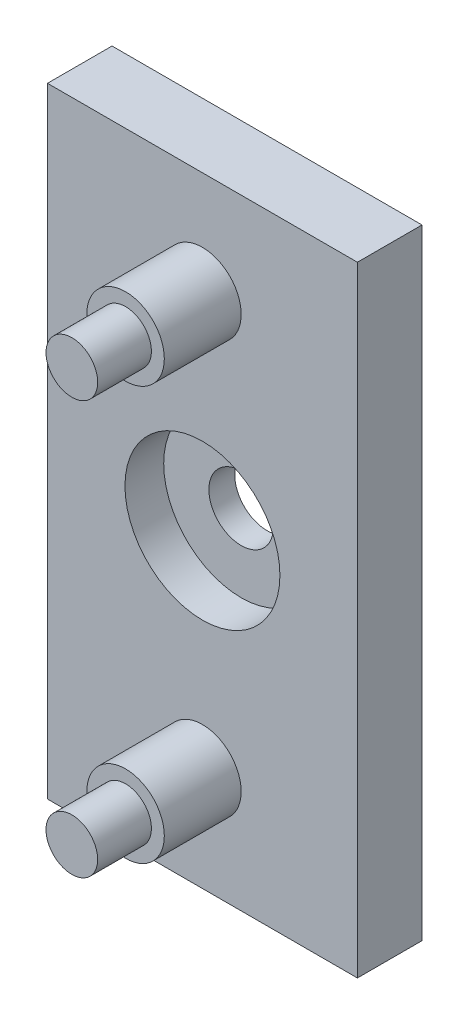
ISO-10303-21;
HEADER;
FILE_DESCRIPTION(('STEP AP214'),'2;1');
FILE_NAME('part.step','',(''),(''),'','','');
FILE_SCHEMA(('AUTOMOTIVE_DESIGN { 1 0 10303 214 1 1 1 1 }'));
ENDSEC;
DATA;
#1=APPLICATION_CONTEXT('core data for automotive mechanical design processes');
#2=APPLICATION_PROTOCOL_DEFINITION('international standard','automotive_design',2000,#1);
#3=PRODUCT_CONTEXT('',#1,'mechanical');
#4=PRODUCT('Part','Part','',(#3));
#5=PRODUCT_RELATED_PRODUCT_CATEGORY('part','',(#4));
#6=PRODUCT_DEFINITION_FORMATION('','',#4);
#7=PRODUCT_DEFINITION_CONTEXT('part definition',#1,'design');
#8=PRODUCT_DEFINITION('design','',#6,#7);
#9=PRODUCT_DEFINITION_SHAPE('','',#8);
#10=(LENGTH_UNIT() NAMED_UNIT(*) SI_UNIT(.MILLI.,.METRE.));
#11=(NAMED_UNIT(*) PLANE_ANGLE_UNIT() SI_UNIT($,.RADIAN.));
#12=(NAMED_UNIT(*) SI_UNIT($,.STERADIAN.) SOLID_ANGLE_UNIT());
#13=UNCERTAINTY_MEASURE_WITH_UNIT(LENGTH_MEASURE(1.E-05),#10,'distance_accuracy_value','');
#14=(GEOMETRIC_REPRESENTATION_CONTEXT(3) GLOBAL_UNCERTAINTY_ASSIGNED_CONTEXT((#13)) GLOBAL_UNIT_ASSIGNED_CONTEXT((#10,
#11,#12)) REPRESENTATION_CONTEXT('',''));
#15=CARTESIAN_POINT('',(0.,0.,0.));
#16=DIRECTION('',(0.,0.,1.));
#17=DIRECTION('',(1.,0.,0.));
#18=AXIS2_PLACEMENT_3D('',#15,#16,#17);
#19=CARTESIAN_POINT('',(19.05,-38.1,7.9375));
#20=DIRECTION('',(-1.,0.,0.));
#21=DIRECTION('',(0.,0.,1.));
#22=AXIS2_PLACEMENT_3D('',#19,#20,#21);
#23=PLANE('',#22);
#24=DIRECTION('',(0.,1.,0.));
#25=VECTOR('',#24,1.);
#26=CARTESIAN_POINT('',(19.05,-38.1,0.));
#27=LINE('',#26,#25);
#28=CARTESIAN_POINT('',(19.05,-38.1,0.));
#29=VERTEX_POINT('',#28);
#30=CARTESIAN_POINT('',(19.05,38.1,0.));
#31=VERTEX_POINT('',#30);
#32=EDGE_CURVE('E109',#29,#31,#27,.T.);
#33=ORIENTED_EDGE('',*,*,#32,.T.);
#34=DIRECTION('',(0.,0.,-1.));
#35=VECTOR('',#34,1.);
#36=CARTESIAN_POINT('',(19.05,38.1,7.9375));
#37=LINE('',#36,#35);
#38=CARTESIAN_POINT('',(19.05,38.1,7.9375));
#39=VERTEX_POINT('',#38);
#40=EDGE_CURVE('E100',#39,#31,#37,.T.);
#41=ORIENTED_EDGE('',*,*,#40,.F.);
#42=DIRECTION('',(0.,1.,0.));
#43=VECTOR('',#42,1.);
#44=CARTESIAN_POINT('',(19.05,-38.1,7.9375));
#45=LINE('',#44,#43);
#46=CARTESIAN_POINT('',(19.05,-38.1,7.9375));
#47=VERTEX_POINT('',#46);
#48=EDGE_CURVE('E94',#47,#39,#45,.T.);
#49=ORIENTED_EDGE('',*,*,#48,.F.);
#50=DIRECTION('',(0.,0.,-1.));
#51=VECTOR('',#50,1.);
#52=CARTESIAN_POINT('',(19.05,-38.1,7.9375));
#53=LINE('',#52,#51);
#54=EDGE_CURVE('E105',#47,#29,#53,.T.);
#55=ORIENTED_EDGE('',*,*,#54,.T.);
#56=EDGE_LOOP('',(#33,#41,#49,#55));
#57=FACE_BOUND('',#56,.T.);
#58=ADVANCED_FACE('F41',(#57),#23,.F.);
#59=CARTESIAN_POINT('',(-19.05,38.1,7.9375));
#60=DIRECTION('',(0.,-1.,0.));
#61=DIRECTION('',(0.,0.,-1.));
#62=AXIS2_PLACEMENT_3D('',#59,#60,#61);
#63=PLANE('',#62);
#64=DIRECTION('',(-1.,0.,0.));
#65=VECTOR('',#64,1.);
#66=CARTESIAN_POINT('',(-19.05,38.1,0.));
#67=LINE('',#66,#65);
#68=CARTESIAN_POINT('',(-19.05,38.1,0.));
#69=VERTEX_POINT('',#68);
#70=EDGE_CURVE('E99',#31,#69,#67,.T.);
#71=ORIENTED_EDGE('',*,*,#70,.T.);
#72=DIRECTION('',(0.,0.,-1.));
#73=VECTOR('',#72,1.);
#74=CARTESIAN_POINT('',(-19.05,38.1,7.9375));
#75=LINE('',#74,#73);
#76=CARTESIAN_POINT('',(-19.05,38.1,7.9375));
#77=VERTEX_POINT('',#76);
#78=EDGE_CURVE('E97',#77,#69,#75,.T.);
#79=ORIENTED_EDGE('',*,*,#78,.F.);
#80=DIRECTION('',(-1.,0.,0.));
#81=VECTOR('',#80,1.);
#82=CARTESIAN_POINT('',(-19.05,38.1,7.9375));
#83=LINE('',#82,#81);
#84=EDGE_CURVE('E89',#39,#77,#83,.T.);
#85=ORIENTED_EDGE('',*,*,#84,.F.);
#86=ORIENTED_EDGE('',*,*,#40,.T.);
#87=EDGE_LOOP('',(#71,#79,#85,#86));
#88=FACE_BOUND('',#87,.T.);
#89=ADVANCED_FACE('F98',(#88),#63,.F.);
#90=CARTESIAN_POINT('',(-19.05,-38.1,7.9375));
#91=DIRECTION('',(1.,0.,0.));
#92=DIRECTION('',(0.,0.,-1.));
#93=AXIS2_PLACEMENT_3D('',#90,#91,#92);
#94=PLANE('',#93);
#95=DIRECTION('',(0.,-1.,0.));
#96=VECTOR('',#95,1.);
#97=CARTESIAN_POINT('',(-19.05,-38.1,0.));
#98=LINE('',#97,#96);
#99=CARTESIAN_POINT('',(-19.05,-38.1,0.));
#100=VERTEX_POINT('',#99);
#101=EDGE_CURVE('E75',#69,#100,#98,.T.);
#102=ORIENTED_EDGE('',*,*,#101,.T.);
#103=DIRECTION('',(0.,0.,-1.));
#104=VECTOR('',#103,1.);
#105=CARTESIAN_POINT('',(-19.05,-38.1,7.9375));
#106=LINE('',#105,#104);
#107=CARTESIAN_POINT('',(-19.05,-38.1,7.9375));
#108=VERTEX_POINT('',#107);
#109=EDGE_CURVE('E101',#108,#100,#106,.T.);
#110=ORIENTED_EDGE('',*,*,#109,.F.);
#111=DIRECTION('',(0.,-1.,0.));
#112=VECTOR('',#111,1.);
#113=CARTESIAN_POINT('',(-19.05,-38.1,7.9375));
#114=LINE('',#113,#112);
#115=EDGE_CURVE('E92',#77,#108,#114,.T.);
#116=ORIENTED_EDGE('',*,*,#115,.F.);
#117=ORIENTED_EDGE('',*,*,#78,.T.);
#118=EDGE_LOOP('',(#102,#110,#116,#117));
#119=FACE_BOUND('',#118,.T.);
#120=ADVANCED_FACE('F103',(#119),#94,.F.);
#121=CARTESIAN_POINT('',(-19.05,-38.1,7.9375));
#122=DIRECTION('',(0.,1.,0.));
#123=DIRECTION('',(0.,0.,1.));
#124=AXIS2_PLACEMENT_3D('',#121,#122,#123);
#125=PLANE('',#124);
#126=DIRECTION('',(1.,0.,0.));
#127=VECTOR('',#126,1.);
#128=CARTESIAN_POINT('',(-19.05,-38.1,0.));
#129=LINE('',#128,#127);
#130=EDGE_CURVE('E81',#100,#29,#129,.T.);
#131=ORIENTED_EDGE('',*,*,#130,.T.);
#132=ORIENTED_EDGE('',*,*,#54,.F.);
#133=DIRECTION('',(1.,0.,0.));
#134=VECTOR('',#133,1.);
#135=CARTESIAN_POINT('',(-19.05,-38.1,7.9375));
#136=LINE('',#135,#134);
#137=EDGE_CURVE('E58',#108,#47,#136,.T.);
#138=ORIENTED_EDGE('',*,*,#137,.F.);
#139=ORIENTED_EDGE('',*,*,#109,.T.);
#140=EDGE_LOOP('',(#131,#132,#138,#139));
#141=FACE_BOUND('',#140,.T.);
#142=ADVANCED_FACE('F182',(#141),#125,.F.);
#143=CARTESIAN_POINT('',(0.,0.,7.9375));
#144=DIRECTION('',(0.,0.,-1.));
#145=DIRECTION('',(-1.,0.,0.));
#146=AXIS2_PLACEMENT_3D('',#143,#144,#145);
#147=PLANE('',#146);
#148=CARTESIAN_POINT('',(0.,-25.4,7.9375));
#149=DIRECTION('',(0.,0.,-1.));
#150=DIRECTION('',(1.,0.,0.));
#151=AXIS2_PLACEMENT_3D('',#148,#149,#150);
#152=CIRCLE('',#151,4.7625);
#153=CARTESIAN_POINT('',(4.7625,-25.4,7.9375));
#154=VERTEX_POINT('',#153);
#155=EDGE_CURVE('E140',#154,#154,#152,.T.);
#156=ORIENTED_EDGE('',*,*,#155,.T.);
#157=EDGE_LOOP('',(#156));
#158=FACE_BOUND('',#157,.T.);
#159=CARTESIAN_POINT('',(0.,25.4,7.9375));
#160=DIRECTION('',(0.,0.,-1.));
#161=DIRECTION('',(-1.,0.,0.));
#162=AXIS2_PLACEMENT_3D('',#159,#160,#161);
#163=CIRCLE('',#162,4.7625);
#164=CARTESIAN_POINT('',(-4.7625,25.4,7.9375));
#165=VERTEX_POINT('',#164);
#166=EDGE_CURVE('E44',#165,#165,#163,.F.);
#167=ORIENTED_EDGE('',*,*,#166,.F.);
#168=EDGE_LOOP('',(#167));
#169=FACE_BOUND('',#168,.T.);
#170=CARTESIAN_POINT('',(0.,0.,7.9375));
#171=DIRECTION('',(0.,0.,1.));
#172=DIRECTION('',(1.,0.,0.));
#173=AXIS2_PLACEMENT_3D('',#170,#171,#172);
#174=CIRCLE('',#173,9.525);
#175=CARTESIAN_POINT('',(9.525,0.,7.9375));
#176=VERTEX_POINT('',#175);
#177=EDGE_CURVE('E126',#176,#176,#174,.T.);
#178=ORIENTED_EDGE('',*,*,#177,.F.);
#179=EDGE_LOOP('',(#178));
#180=FACE_BOUND('',#179,.T.);
#181=ORIENTED_EDGE('',*,*,#48,.T.);
#182=ORIENTED_EDGE('',*,*,#84,.T.);
#183=ORIENTED_EDGE('',*,*,#115,.T.);
#184=ORIENTED_EDGE('',*,*,#137,.T.);
#185=EDGE_LOOP('',(#181,#182,#183,#184));
#186=FACE_BOUND('',#185,.T.);
#187=ADVANCED_FACE('F90',(#158,#169,#180,#186),#147,.F.);
#188=CARTESIAN_POINT('',(0.,0.,0.));
#189=DIRECTION('',(0.,0.,-1.));
#190=DIRECTION('',(-1.,0.,0.));
#191=AXIS2_PLACEMENT_3D('',#188,#189,#190);
#192=PLANE('',#191);
#193=CARTESIAN_POINT('',(0.,0.,0.));
#194=DIRECTION('',(0.,0.,1.));
#195=DIRECTION('',(1.,0.,0.));
#196=AXIS2_PLACEMENT_3D('',#193,#194,#195);
#197=CIRCLE('',#196,3.96875);
#198=CARTESIAN_POINT('',(3.96875,0.,0.));
#199=VERTEX_POINT('',#198);
#200=EDGE_CURVE('E112',#199,#199,#197,.T.);
#201=ORIENTED_EDGE('',*,*,#200,.T.);
#202=EDGE_LOOP('',(#201));
#203=FACE_BOUND('',#202,.T.);
#204=ORIENTED_EDGE('',*,*,#32,.F.);
#205=ORIENTED_EDGE('',*,*,#130,.F.);
#206=ORIENTED_EDGE('',*,*,#101,.F.);
#207=ORIENTED_EDGE('',*,*,#70,.F.);
#208=EDGE_LOOP('',(#204,#205,#206,#207));
#209=FACE_BOUND('',#208,.T.);
#210=ADVANCED_FACE('F170',(#203,#209),#192,.T.);
#211=CARTESIAN_POINT('',(0.,0.,0.));
#212=DIRECTION('',(0.,0.,1.));
#213=DIRECTION('',(1.,0.,0.));
#214=AXIS2_PLACEMENT_3D('',#211,#212,#213);
#215=CYLINDRICAL_SURFACE('',#214,3.96875);
#216=CARTESIAN_POINT('',(0.,0.,3.175));
#217=DIRECTION('',(0.,0.,-1.));
#218=DIRECTION('',(-1.,0.,0.));
#219=AXIS2_PLACEMENT_3D('',#216,#217,#218);
#220=CIRCLE('',#219,3.96875);
#221=CARTESIAN_POINT('',(-3.96875,0.,3.175));
#222=VERTEX_POINT('',#221);
#223=EDGE_CURVE('E118',#222,#222,#220,.F.);
#224=ORIENTED_EDGE('',*,*,#223,.T.);
#225=EDGE_LOOP('',(#224));
#226=FACE_BOUND('',#225,.T.);
#227=ORIENTED_EDGE('',*,*,#200,.F.);
#228=EDGE_LOOP('',(#227));
#229=FACE_BOUND('',#228,.T.);
#230=ADVANCED_FACE('F172',(#226,#229),#215,.F.);
#231=CARTESIAN_POINT('',(0.,0.,3.175));
#232=DIRECTION('',(0.,0.,-1.));
#233=DIRECTION('',(-1.,0.,0.));
#234=AXIS2_PLACEMENT_3D('',#231,#232,#233);
#235=PLANE('',#234);
#236=CARTESIAN_POINT('',(0.,0.,3.175));
#237=DIRECTION('',(0.,0.,-1.));
#238=DIRECTION('',(-1.,0.,0.));
#239=AXIS2_PLACEMENT_3D('',#236,#237,#238);
#240=CIRCLE('',#239,9.525);
#241=CARTESIAN_POINT('',(-9.525,0.,3.175));
#242=VERTEX_POINT('',#241);
#243=EDGE_CURVE('E120',#242,#242,#240,.F.);
#244=ORIENTED_EDGE('',*,*,#243,.T.);
#245=EDGE_LOOP('',(#244));
#246=FACE_BOUND('',#245,.T.);
#247=ORIENTED_EDGE('',*,*,#223,.F.);
#248=EDGE_LOOP('',(#247));
#249=FACE_BOUND('',#248,.T.);
#250=ADVANCED_FACE('F179',(#246,#249),#235,.F.);
#251=CARTESIAN_POINT('',(0.,0.,-26.9407683632075));
#252=DIRECTION('',(0.,0.,1.));
#253=DIRECTION('',(1.,0.,0.));
#254=AXIS2_PLACEMENT_3D('',#251,#252,#253);
#255=CYLINDRICAL_SURFACE('',#254,9.525);
#256=ORIENTED_EDGE('',*,*,#177,.T.);
#257=EDGE_LOOP('',(#256));
#258=FACE_BOUND('',#257,.T.);
#259=ORIENTED_EDGE('',*,*,#243,.F.);
#260=EDGE_LOOP('',(#259));
#261=FACE_BOUND('',#260,.T.);
#262=ADVANCED_FACE('F225',(#258,#261),#255,.F.);
#263=CARTESIAN_POINT('',(0.,25.4,17.3863));
#264=DIRECTION('',(0.,0.,-1.));
#265=DIRECTION('',(-1.,0.,0.));
#266=AXIS2_PLACEMENT_3D('',#263,#264,#265);
#267=CYLINDRICAL_SURFACE('',#266,4.7625);
#268=CARTESIAN_POINT('',(0.,25.4,17.3863));
#269=DIRECTION('',(0.,0.,1.));
#270=DIRECTION('',(1.,0.,0.));
#271=AXIS2_PLACEMENT_3D('',#268,#269,#270);
#272=CIRCLE('',#271,4.7625);
#273=CARTESIAN_POINT('',(4.7625,25.4,17.3863));
#274=VERTEX_POINT('',#273);
#275=EDGE_CURVE('E131',#274,#274,#272,.T.);
#276=ORIENTED_EDGE('',*,*,#275,.F.);
#277=EDGE_LOOP('',(#276));
#278=FACE_BOUND('',#277,.T.);
#279=ORIENTED_EDGE('',*,*,#166,.T.);
#280=EDGE_LOOP('',(#279));
#281=FACE_BOUND('',#280,.T.);
#282=ADVANCED_FACE('F234',(#278,#281),#267,.T.);
#283=CARTESIAN_POINT('',(0.,25.4,17.3863));
#284=DIRECTION('',(0.,0.,1.));
#285=DIRECTION('',(1.,0.,0.));
#286=AXIS2_PLACEMENT_3D('',#283,#284,#285);
#287=PLANE('',#286);
#288=CARTESIAN_POINT('',(0.,25.4,17.3863));
#289=DIRECTION('',(0.,0.,1.));
#290=DIRECTION('',(1.,0.,0.));
#291=AXIS2_PLACEMENT_3D('',#288,#289,#290);
#292=CIRCLE('',#291,3.175);
#293=CARTESIAN_POINT('',(-3.175,25.4,17.3863));
#294=VERTEX_POINT('',#293);
#295=EDGE_CURVE('E12',#294,#294,#292,.T.);
#296=ORIENTED_EDGE('',*,*,#295,.F.);
#297=EDGE_LOOP('',(#296));
#298=FACE_BOUND('',#297,.T.);
#299=ORIENTED_EDGE('',*,*,#275,.T.);
#300=EDGE_LOOP('',(#299));
#301=FACE_BOUND('',#300,.T.);
#302=ADVANCED_FACE('F244',(#298,#301),#287,.T.);
#303=CARTESIAN_POINT('',(0.,25.4,23.9903));
#304=DIRECTION('',(0.,0.,-1.));
#305=DIRECTION('',(-1.,0.,0.));
#306=AXIS2_PLACEMENT_3D('',#303,#304,#305);
#307=CYLINDRICAL_SURFACE('',#306,3.175);
#308=CARTESIAN_POINT('',(0.,25.4,23.9903));
#309=DIRECTION('',(0.,0.,1.));
#310=DIRECTION('',(1.,0.,0.));
#311=AXIS2_PLACEMENT_3D('',#308,#309,#310);
#312=CIRCLE('',#311,3.175);
#313=CARTESIAN_POINT('',(-3.175,25.4,23.9903));
#314=VERTEX_POINT('',#313);
#315=EDGE_CURVE('E135',#314,#314,#312,.T.);
#316=CARTESIAN_POINT('',(-3.175,25.4,23.9903));
#317=CARTESIAN_POINT('',(-3.175,25.4,23.9215083333333));
#318=CARTESIAN_POINT('',(-3.175,25.4,23.8527166666667));
#319=CARTESIAN_POINT('',(-3.175,25.4,23.7151333333333));
#320=CARTESIAN_POINT('',(-3.175,25.4,23.6463416666667));
#321=CARTESIAN_POINT('',(-3.175,25.4,23.5087583333333));
#322=CARTESIAN_POINT('',(-3.175,25.4,23.4399666666667));
#323=CARTESIAN_POINT('',(-3.175,25.4,23.3023833333333));
#324=CARTESIAN_POINT('',(-3.175,25.4,23.2335916666667));
#325=CARTESIAN_POINT('',(-3.175,25.4,23.0960083333333));
#326=CARTESIAN_POINT('',(-3.175,25.4,23.0272166666667));
#327=CARTESIAN_POINT('',(-3.175,25.4,22.8896333333333));
#328=CARTESIAN_POINT('',(-3.175,25.4,22.8208416666667));
#329=CARTESIAN_POINT('',(-3.175,25.4,22.6832583333333));
#330=CARTESIAN_POINT('',(-3.175,25.4,22.6144666666667));
#331=CARTESIAN_POINT('',(-3.175,25.4,22.4768833333333));
#332=CARTESIAN_POINT('',(-3.175,25.4,22.4080916666667));
#333=CARTESIAN_POINT('',(-3.175,25.4,22.2705083333333));
#334=CARTESIAN_POINT('',(-3.175,25.4,22.2017166666667));
#335=CARTESIAN_POINT('',(-3.175,25.4,22.0641333333333));
#336=CARTESIAN_POINT('',(-3.175,25.4,21.9953416666667));
#337=CARTESIAN_POINT('',(-3.175,25.4,21.8577583333333));
#338=CARTESIAN_POINT('',(-3.175,25.4,21.7889666666667));
#339=CARTESIAN_POINT('',(-3.175,25.4,21.6513833333333));
#340=CARTESIAN_POINT('',(-3.175,25.4,21.5825916666667));
#341=CARTESIAN_POINT('',(-3.175,25.4,21.4450083333333));
#342=CARTESIAN_POINT('',(-3.175,25.4,21.3762166666667));
#343=CARTESIAN_POINT('',(-3.175,25.4,21.2386333333333));
#344=CARTESIAN_POINT('',(-3.175,25.4,21.1698416666667));
#345=CARTESIAN_POINT('',(-3.175,25.4,21.0322583333333));
#346=CARTESIAN_POINT('',(-3.175,25.4,20.9634666666667));
#347=CARTESIAN_POINT('',(-3.175,25.4,20.8258833333333));
#348=CARTESIAN_POINT('',(-3.175,25.4,20.7570916666667));
#349=CARTESIAN_POINT('',(-3.175,25.4,20.6195083333333));
#350=CARTESIAN_POINT('',(-3.175,25.4,20.5507166666667));
#351=CARTESIAN_POINT('',(-3.175,25.4,20.4131333333333));
#352=CARTESIAN_POINT('',(-3.175,25.4,20.3443416666667));
#353=CARTESIAN_POINT('',(-3.175,25.4,20.2067583333333));
#354=CARTESIAN_POINT('',(-3.175,25.4,20.1379666666667));
#355=CARTESIAN_POINT('',(-3.175,25.4,20.0003833333333));
#356=CARTESIAN_POINT('',(-3.175,25.4,19.9315916666667));
#357=CARTESIAN_POINT('',(-3.175,25.4,19.7940083333333));
#358=CARTESIAN_POINT('',(-3.175,25.4,19.7252166666667));
#359=CARTESIAN_POINT('',(-3.175,25.4,19.5876333333333));
#360=CARTESIAN_POINT('',(-3.175,25.4,19.5188416666667));
#361=CARTESIAN_POINT('',(-3.175,25.4,19.3812583333333));
#362=CARTESIAN_POINT('',(-3.175,25.4,19.3124666666667));
#363=CARTESIAN_POINT('',(-3.175,25.4,19.1748833333333));
#364=CARTESIAN_POINT('',(-3.175,25.4,19.1060916666667));
#365=CARTESIAN_POINT('',(-3.175,25.4,18.9685083333333));
#366=CARTESIAN_POINT('',(-3.175,25.4,18.8997166666667));
#367=CARTESIAN_POINT('',(-3.175,25.4,18.7621333333333));
#368=CARTESIAN_POINT('',(-3.175,25.4,18.6933416666667));
#369=CARTESIAN_POINT('',(-3.175,25.4,18.5557583333333));
#370=CARTESIAN_POINT('',(-3.175,25.4,18.4869666666667));
#371=CARTESIAN_POINT('',(-3.175,25.4,18.3493833333333));
#372=CARTESIAN_POINT('',(-3.175,25.4,18.2805916666667));
#373=CARTESIAN_POINT('',(-3.175,25.4,18.1430083333333));
#374=CARTESIAN_POINT('',(-3.175,25.4,18.0742166666667));
#375=CARTESIAN_POINT('',(-3.175,25.4,17.9366333333333));
#376=CARTESIAN_POINT('',(-3.175,25.4,17.8678416666667));
#377=CARTESIAN_POINT('',(-3.175,25.4,17.7302583333333));
#378=CARTESIAN_POINT('',(-3.175,25.4,17.6614666666667));
#379=CARTESIAN_POINT('',(-3.175,25.4,17.5238833333333));
#380=CARTESIAN_POINT('',(-3.175,25.4,17.4550916666667));
#381=CARTESIAN_POINT('',(-3.175,25.4,17.3863));
#382=B_SPLINE_CURVE_WITH_KNOTS('',3,(#316,#317,#318,#319,#320,#321,#322,#323,#324,#325,#326,
#327,#328,#329,#330,#331,#332,#333,#334,#335,#336,#337,#338,#339,#340,#341,#342,#343,#344,#345,
#346,#347,#348,#349,#350,#351,#352,#353,#354,#355,#356,#357,#358,#359,#360,#361,#362,#363,#364,
#365,#366,#367,#368,#369,#370,#371,#372,#373,#374,#375,#376,#377,#378,#379,#380,#381),
.UNSPECIFIED.,.F.,.F.,(4,2,2,2,2,2,2,2,2,2,2,2,2,2,2,2,2,2,2,2,2,2,2,2,2,2,2,2,2,2,2,2,4),(0.,
0.206374999999998,0.41275,0.619124999999998,0.8255,1.031875,1.23825,1.444625,1.651,1.857375,
2.06375,2.270125,2.4765,2.682875,2.88925,3.095625,3.302,3.508375,3.71475,3.921125,4.1275,
4.333875,4.54025,4.746625,4.953,5.159375,5.36575,5.572125,5.7785,5.984875,6.19125,6.397625,
6.604),.UNSPECIFIED.);
#383=EDGE_CURVE('BSEAM254',#314,#294,#382,.T.);
#384=ORIENTED_EDGE('',*,*,#315,.F.);
#385=ORIENTED_EDGE('',*,*,#295,.T.);
#386=ORIENTED_EDGE('',*,*,#383,.T.);
#387=ORIENTED_EDGE('',*,*,#383,.F.);
#388=EDGE_LOOP('',(#384,#386,#385,#387));
#389=FACE_BOUND('',#388,.T.);
#390=ADVANCED_FACE('F254',(#389),#307,.T.);
#391=CARTESIAN_POINT('',(0.,25.4,23.9903));
#392=DIRECTION('',(0.,0.,1.));
#393=DIRECTION('',(1.,0.,0.));
#394=AXIS2_PLACEMENT_3D('',#391,#392,#393);
#395=PLANE('',#394);
#396=ORIENTED_EDGE('',*,*,#315,.T.);
#397=EDGE_LOOP('',(#396));
#398=FACE_BOUND('',#397,.T.);
#399=ADVANCED_FACE('F264',(#398),#395,.T.);
#400=CARTESIAN_POINT('',(0.,-25.4,17.3863));
#401=DIRECTION('',(0.,0.,-1.));
#402=DIRECTION('',(-1.,0.,0.));
#403=AXIS2_PLACEMENT_3D('',#400,#401,#402);
#404=CYLINDRICAL_SURFACE('',#403,4.7625);
#405=CARTESIAN_POINT('',(0.,-25.4,17.3863));
#406=DIRECTION('',(0.,0.,-1.));
#407=DIRECTION('',(1.,0.,0.));
#408=AXIS2_PLACEMENT_3D('',#405,#406,#407);
#409=CIRCLE('',#408,4.7625);
#410=CARTESIAN_POINT('',(4.7625,-25.4,17.3863));
#411=VERTEX_POINT('',#410);
#412=EDGE_CURVE('E139',#411,#411,#409,.T.);
#413=ORIENTED_EDGE('',*,*,#412,.T.);
#414=EDGE_LOOP('',(#413));
#415=FACE_BOUND('',#414,.T.);
#416=ORIENTED_EDGE('',*,*,#155,.F.);
#417=EDGE_LOOP('',(#416));
#418=FACE_BOUND('',#417,.T.);
#419=ADVANCED_FACE('F273',(#415,#418),#404,.T.);
#420=CARTESIAN_POINT('',(0.,-25.4,17.3863));
#421=DIRECTION('',(0.,0.,1.));
#422=DIRECTION('',(1.,0.,0.));
#423=AXIS2_PLACEMENT_3D('',#420,#421,#422);
#424=PLANE('',#423);
#425=CARTESIAN_POINT('',(0.,-25.4,17.3863));
#426=DIRECTION('',(0.,0.,-1.));
#427=DIRECTION('',(1.,0.,0.));
#428=AXIS2_PLACEMENT_3D('',#425,#426,#427);
#429=CIRCLE('',#428,3.175);
#430=CARTESIAN_POINT('',(-3.175,-25.4,17.3863));
#431=VERTEX_POINT('',#430);
#432=EDGE_CURVE('E146',#431,#431,#429,.T.);
#433=ORIENTED_EDGE('',*,*,#432,.T.);
#434=EDGE_LOOP('',(#433));
#435=FACE_BOUND('',#434,.T.);
#436=ORIENTED_EDGE('',*,*,#412,.F.);
#437=EDGE_LOOP('',(#436));
#438=FACE_BOUND('',#437,.T.);
#439=ADVANCED_FACE('F161',(#435,#438),#424,.T.);
#440=CARTESIAN_POINT('',(0.,-25.4,23.9903));
#441=DIRECTION('',(0.,0.,-1.));
#442=DIRECTION('',(-1.,0.,0.));
#443=AXIS2_PLACEMENT_3D('',#440,#441,#442);
#444=CYLINDRICAL_SURFACE('',#443,3.175);
#445=CARTESIAN_POINT('',(0.,-25.4,23.9903));
#446=DIRECTION('',(0.,0.,-1.));
#447=DIRECTION('',(1.,0.,0.));
#448=AXIS2_PLACEMENT_3D('',#445,#446,#447);
#449=CIRCLE('',#448,3.175);
#450=CARTESIAN_POINT('',(-3.175,-25.4,23.9903));
#451=VERTEX_POINT('',#450);
#452=EDGE_CURVE('E143',#451,#451,#449,.T.);
#453=CARTESIAN_POINT('',(-3.175,-25.4,23.9903));
#454=CARTESIAN_POINT('',(-3.175,-25.4,23.9215083333333));
#455=CARTESIAN_POINT('',(-3.175,-25.4,23.8527166666667));
#456=CARTESIAN_POINT('',(-3.175,-25.4,23.7151333333333));
#457=CARTESIAN_POINT('',(-3.175,-25.4,23.6463416666667));
#458=CARTESIAN_POINT('',(-3.175,-25.4,23.5087583333333));
#459=CARTESIAN_POINT('',(-3.175,-25.4,23.4399666666667));
#460=CARTESIAN_POINT('',(-3.175,-25.4,23.3023833333333));
#461=CARTESIAN_POINT('',(-3.175,-25.4,23.2335916666667));
#462=CARTESIAN_POINT('',(-3.175,-25.4,23.0960083333333));
#463=CARTESIAN_POINT('',(-3.175,-25.4,23.0272166666667));
#464=CARTESIAN_POINT('',(-3.175,-25.4,22.8896333333333));
#465=CARTESIAN_POINT('',(-3.175,-25.4,22.8208416666667));
#466=CARTESIAN_POINT('',(-3.175,-25.4,22.6832583333333));
#467=CARTESIAN_POINT('',(-3.175,-25.4,22.6144666666667));
#468=CARTESIAN_POINT('',(-3.175,-25.4,22.4768833333333));
#469=CARTESIAN_POINT('',(-3.175,-25.4,22.4080916666667));
#470=CARTESIAN_POINT('',(-3.175,-25.4,22.2705083333333));
#471=CARTESIAN_POINT('',(-3.175,-25.4,22.2017166666667));
#472=CARTESIAN_POINT('',(-3.175,-25.4,22.0641333333333));
#473=CARTESIAN_POINT('',(-3.175,-25.4,21.9953416666667));
#474=CARTESIAN_POINT('',(-3.175,-25.4,21.8577583333333));
#475=CARTESIAN_POINT('',(-3.175,-25.4,21.7889666666667));
#476=CARTESIAN_POINT('',(-3.175,-25.4,21.6513833333333));
#477=CARTESIAN_POINT('',(-3.175,-25.4,21.5825916666667));
#478=CARTESIAN_POINT('',(-3.175,-25.4,21.4450083333333));
#479=CARTESIAN_POINT('',(-3.175,-25.4,21.3762166666667));
#480=CARTESIAN_POINT('',(-3.175,-25.4,21.2386333333333));
#481=CARTESIAN_POINT('',(-3.175,-25.4,21.1698416666667));
#482=CARTESIAN_POINT('',(-3.175,-25.4,21.0322583333333));
#483=CARTESIAN_POINT('',(-3.175,-25.4,20.9634666666667));
#484=CARTESIAN_POINT('',(-3.175,-25.4,20.8258833333333));
#485=CARTESIAN_POINT('',(-3.175,-25.4,20.7570916666667));
#486=CARTESIAN_POINT('',(-3.175,-25.4,20.6195083333333));
#487=CARTESIAN_POINT('',(-3.175,-25.4,20.5507166666667));
#488=CARTESIAN_POINT('',(-3.175,-25.4,20.4131333333333));
#489=CARTESIAN_POINT('',(-3.175,-25.4,20.3443416666667));
#490=CARTESIAN_POINT('',(-3.175,-25.4,20.2067583333333));
#491=CARTESIAN_POINT('',(-3.175,-25.4,20.1379666666667));
#492=CARTESIAN_POINT('',(-3.175,-25.4,20.0003833333333));
#493=CARTESIAN_POINT('',(-3.175,-25.4,19.9315916666667));
#494=CARTESIAN_POINT('',(-3.175,-25.4,19.7940083333333));
#495=CARTESIAN_POINT('',(-3.175,-25.4,19.7252166666667));
#496=CARTESIAN_POINT('',(-3.175,-25.4,19.5876333333333));
#497=CARTESIAN_POINT('',(-3.175,-25.4,19.5188416666667));
#498=CARTESIAN_POINT('',(-3.175,-25.4,19.3812583333333));
#499=CARTESIAN_POINT('',(-3.175,-25.4,19.3124666666667));
#500=CARTESIAN_POINT('',(-3.175,-25.4,19.1748833333333));
#501=CARTESIAN_POINT('',(-3.175,-25.4,19.1060916666667));
#502=CARTESIAN_POINT('',(-3.175,-25.4,18.9685083333333));
#503=CARTESIAN_POINT('',(-3.175,-25.4,18.8997166666667));
#504=CARTESIAN_POINT('',(-3.175,-25.4,18.7621333333333));
#505=CARTESIAN_POINT('',(-3.175,-25.4,18.6933416666667));
#506=CARTESIAN_POINT('',(-3.175,-25.4,18.5557583333333));
#507=CARTESIAN_POINT('',(-3.175,-25.4,18.4869666666667));
#508=CARTESIAN_POINT('',(-3.175,-25.4,18.3493833333333));
#509=CARTESIAN_POINT('',(-3.175,-25.4,18.2805916666667));
#510=CARTESIAN_POINT('',(-3.175,-25.4,18.1430083333333));
#511=CARTESIAN_POINT('',(-3.175,-25.4,18.0742166666667));
#512=CARTESIAN_POINT('',(-3.175,-25.4,17.9366333333333));
#513=CARTESIAN_POINT('',(-3.175,-25.4,17.8678416666667));
#514=CARTESIAN_POINT('',(-3.175,-25.4,17.7302583333333));
#515=CARTESIAN_POINT('',(-3.175,-25.4,17.6614666666667));
#516=CARTESIAN_POINT('',(-3.175,-25.4,17.5238833333333));
#517=CARTESIAN_POINT('',(-3.175,-25.4,17.4550916666667));
#518=CARTESIAN_POINT('',(-3.175,-25.4,17.3863));
#519=B_SPLINE_CURVE_WITH_KNOTS('',3,(#453,#454,#455,#456,#457,#458,#459,#460,#461,#462,#463,
#464,#465,#466,#467,#468,#469,#470,#471,#472,#473,#474,#475,#476,#477,#478,#479,#480,#481,#482,
#483,#484,#485,#486,#487,#488,#489,#490,#491,#492,#493,#494,#495,#496,#497,#498,#499,#500,#501,
#502,#503,#504,#505,#506,#507,#508,#509,#510,#511,#512,#513,#514,#515,#516,#517,#518),
.UNSPECIFIED.,.F.,.F.,(4,2,2,2,2,2,2,2,2,2,2,2,2,2,2,2,2,2,2,2,2,2,2,2,2,2,2,2,2,2,2,2,4),(0.,
0.206374999999998,0.412749999999996,0.619124999999998,0.825499999999996,1.031875,1.23825,
1.444625,1.651,1.857375,2.06375,2.270125,2.4765,2.682875,2.88925,3.095625,3.302,3.508375,
3.71475,3.921125,4.1275,4.333875,4.54025,4.746625,4.953,5.159375,5.36575,5.572125,5.7785,
5.984875,6.19125,6.397625,6.604),.UNSPECIFIED.);
#520=EDGE_CURVE('BSEAM152',#451,#431,#519,.T.);
#521=ORIENTED_EDGE('',*,*,#452,.T.);
#522=ORIENTED_EDGE('',*,*,#432,.F.);
#523=ORIENTED_EDGE('',*,*,#520,.T.);
#524=ORIENTED_EDGE('',*,*,#520,.F.);
#525=EDGE_LOOP('',(#521,#523,#522,#524));
#526=FACE_BOUND('',#525,.T.);
#527=ADVANCED_FACE('F152',(#526),#444,.T.);
#528=CARTESIAN_POINT('',(0.,-25.4,23.9903));
#529=DIRECTION('',(0.,0.,1.));
#530=DIRECTION('',(1.,0.,0.));
#531=AXIS2_PLACEMENT_3D('',#528,#529,#530);
#532=PLANE('',#531);
#533=ORIENTED_EDGE('',*,*,#452,.F.);
#534=EDGE_LOOP('',(#533));
#535=FACE_BOUND('',#534,.T.);
#536=ADVANCED_FACE('F155',(#535),#532,.T.);
#537=CLOSED_SHELL('',(#58,#89,#120,#142,#187,#210,#230,#250,#262,#282,#302,#390,#399,#419,#439,
#527,#536));
#538=MANIFOLD_SOLID_BREP('B2',#537);
#539=ADVANCED_BREP_SHAPE_REPRESENTATION('',(#18,#538),#14);
#540=SHAPE_DEFINITION_REPRESENTATION(#9,#539);
ENDSEC;
END-ISO-10303-21;
